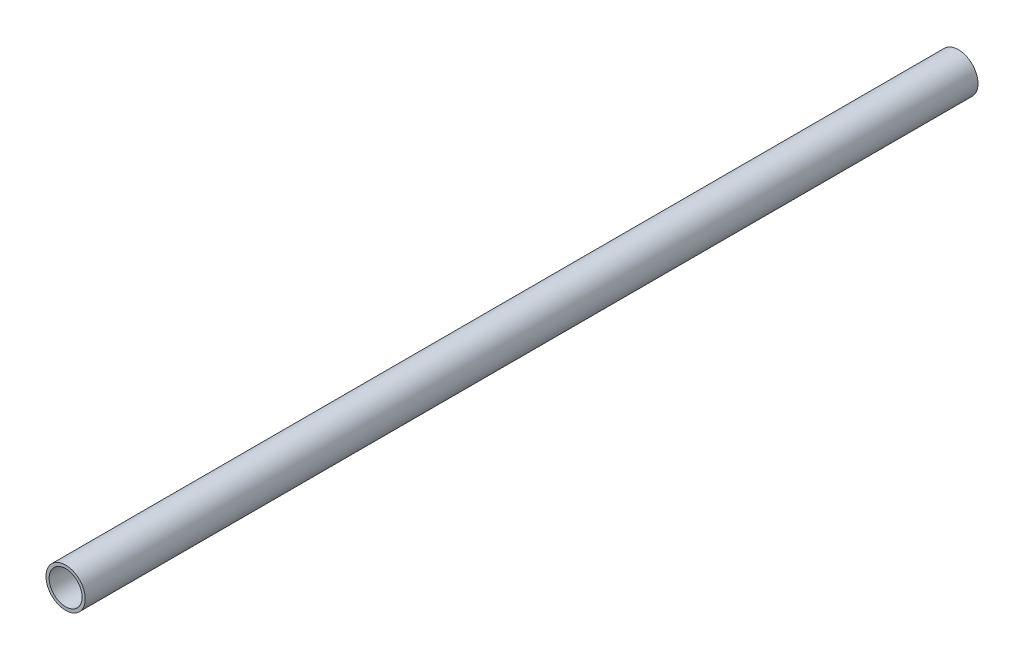
ISO-10303-21;
HEADER;
FILE_DESCRIPTION(('STEP AP214'),'2;1');
FILE_NAME('part.step','',(''),(''),'','','');
FILE_SCHEMA(('AUTOMOTIVE_DESIGN { 1 0 10303 214 1 1 1 1 }'));
ENDSEC;
DATA;
#1=APPLICATION_CONTEXT('core data for automotive mechanical design processes');
#2=APPLICATION_PROTOCOL_DEFINITION('international standard','automotive_design',2000,#1);
#3=PRODUCT_CONTEXT('',#1,'mechanical');
#4=PRODUCT('Part','Part','',(#3));
#5=PRODUCT_RELATED_PRODUCT_CATEGORY('part','',(#4));
#6=PRODUCT_DEFINITION_FORMATION('','',#4);
#7=PRODUCT_DEFINITION_CONTEXT('part definition',#1,'design');
#8=PRODUCT_DEFINITION('design','',#6,#7);
#9=PRODUCT_DEFINITION_SHAPE('','',#8);
#10=(LENGTH_UNIT() NAMED_UNIT(*) SI_UNIT(.MILLI.,.METRE.));
#11=(NAMED_UNIT(*) PLANE_ANGLE_UNIT() SI_UNIT($,.RADIAN.));
#12=(NAMED_UNIT(*) SI_UNIT($,.STERADIAN.) SOLID_ANGLE_UNIT());
#13=UNCERTAINTY_MEASURE_WITH_UNIT(LENGTH_MEASURE(1.E-05),#10,'distance_accuracy_value','');
#14=(GEOMETRIC_REPRESENTATION_CONTEXT(3) GLOBAL_UNCERTAINTY_ASSIGNED_CONTEXT((#13)) GLOBAL_UNIT_ASSIGNED_CONTEXT((#10,
#11,#12)) REPRESENTATION_CONTEXT('',''));
#15=CARTESIAN_POINT('',(0.,0.,0.));
#16=DIRECTION('',(0.,0.,1.));
#17=DIRECTION('',(1.,0.,0.));
#18=AXIS2_PLACEMENT_3D('',#15,#16,#17);
#19=CARTESIAN_POINT('',(0.,0.,568.));
#20=DIRECTION('',(0.,0.,1.));
#21=DIRECTION('',(1.,0.,0.));
#22=AXIS2_PLACEMENT_3D('',#19,#20,#21);
#23=PLANE('',#22);
#24=CARTESIAN_POINT('',(0.,0.,568.));
#25=DIRECTION('',(0.,0.,1.));
#26=DIRECTION('',(1.,0.,0.));
#27=AXIS2_PLACEMENT_3D('',#24,#25,#26);
#28=CIRCLE('',#27,12.5);
#29=CARTESIAN_POINT('',(12.5,0.,568.));
#30=VERTEX_POINT('',#29);
#31=EDGE_CURVE('E10',#30,#30,#28,.T.);
#32=ORIENTED_EDGE('',*,*,#31,.T.);
#33=EDGE_LOOP('',(#32));
#34=FACE_BOUND('',#33,.T.);
#35=CARTESIAN_POINT('',(0.,0.,568.));
#36=DIRECTION('',(0.,0.,1.));
#37=DIRECTION('',(1.,0.,0.));
#38=AXIS2_PLACEMENT_3D('',#35,#36,#37);
#39=CIRCLE('',#38,10.5);
#40=CARTESIAN_POINT('',(10.5,0.,568.));
#41=VERTEX_POINT('',#40);
#42=EDGE_CURVE('E42',#41,#41,#39,.T.);
#43=ORIENTED_EDGE('',*,*,#42,.F.);
#44=EDGE_LOOP('',(#43));
#45=FACE_BOUND('',#44,.T.);
#46=ADVANCED_FACE('F31',(#34,#45),#23,.T.);
#47=CARTESIAN_POINT('',(0.,0.,0.));
#48=DIRECTION('',(0.,0.,1.));
#49=DIRECTION('',(1.,0.,0.));
#50=AXIS2_PLACEMENT_3D('',#47,#48,#49);
#51=PLANE('',#50);
#52=CARTESIAN_POINT('',(0.,0.,0.));
#53=DIRECTION('',(0.,0.,1.));
#54=DIRECTION('',(1.,0.,0.));
#55=AXIS2_PLACEMENT_3D('',#52,#53,#54);
#56=CIRCLE('',#55,12.5);
#57=CARTESIAN_POINT('',(12.5,0.,0.));
#58=VERTEX_POINT('',#57);
#59=EDGE_CURVE('E35',#58,#58,#56,.T.);
#60=ORIENTED_EDGE('',*,*,#59,.F.);
#61=EDGE_LOOP('',(#60));
#62=FACE_BOUND('',#61,.T.);
#63=CARTESIAN_POINT('',(0.,0.,0.));
#64=DIRECTION('',(0.,0.,1.));
#65=DIRECTION('',(1.,0.,0.));
#66=AXIS2_PLACEMENT_3D('',#63,#64,#65);
#67=CIRCLE('',#66,10.5);
#68=CARTESIAN_POINT('',(10.5,0.,0.));
#69=VERTEX_POINT('',#68);
#70=EDGE_CURVE('E44',#69,#69,#67,.T.);
#71=ORIENTED_EDGE('',*,*,#70,.T.);
#72=EDGE_LOOP('',(#71));
#73=FACE_BOUND('',#72,.T.);
#74=ADVANCED_FACE('F54',(#62,#73),#51,.F.);
#75=CARTESIAN_POINT('',(0.,0.,568.));
#76=DIRECTION('',(0.,0.,-1.));
#77=DIRECTION('',(-1.,0.,0.));
#78=AXIS2_PLACEMENT_3D('',#75,#76,#77);
#79=CYLINDRICAL_SURFACE('',#78,12.5);
#80=ORIENTED_EDGE('',*,*,#31,.F.);
#81=EDGE_LOOP('',(#80));
#82=FACE_BOUND('',#81,.T.);
#83=ORIENTED_EDGE('',*,*,#59,.T.);
#84=EDGE_LOOP('',(#83));
#85=FACE_BOUND('',#84,.T.);
#86=ADVANCED_FACE('F33',(#82,#85),#79,.T.);
#87=CARTESIAN_POINT('',(0.,0.,568.));
#88=DIRECTION('',(0.,0.,-1.));
#89=DIRECTION('',(-1.,0.,0.));
#90=AXIS2_PLACEMENT_3D('',#87,#88,#89);
#91=CYLINDRICAL_SURFACE('',#90,10.5);
#92=ORIENTED_EDGE('',*,*,#42,.T.);
#93=EDGE_LOOP('',(#92));
#94=FACE_BOUND('',#93,.T.);
#95=ORIENTED_EDGE('',*,*,#70,.F.);
#96=EDGE_LOOP('',(#95));
#97=FACE_BOUND('',#96,.T.);
#98=ADVANCED_FACE('F50',(#94,#97),#91,.F.);
#99=CLOSED_SHELL('',(#46,#74,#86,#98));
#100=MANIFOLD_SOLID_BREP('B2',#99);
#101=ADVANCED_BREP_SHAPE_REPRESENTATION('',(#18,#100),#14);
#102=SHAPE_DEFINITION_REPRESENTATION(#9,#101);
ENDSEC;
END-ISO-10303-21;
